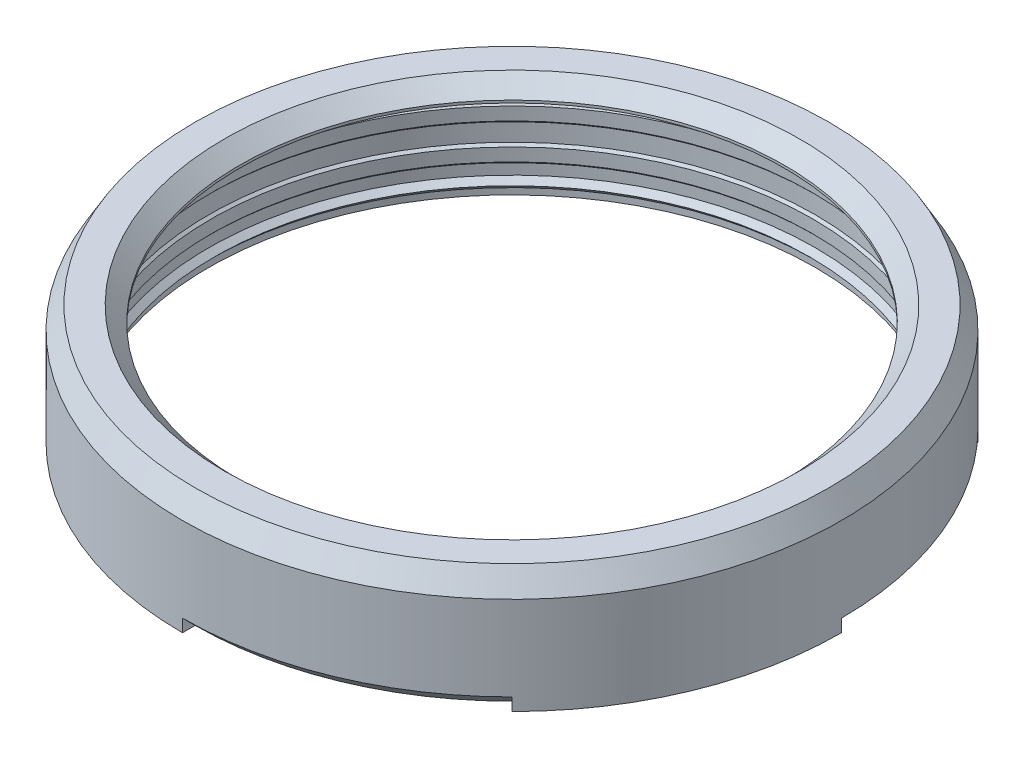
ISO-10303-21;
HEADER;
FILE_DESCRIPTION(('STEP AP214'),'2;1');
FILE_NAME('part.step','',(''),(''),'','','');
FILE_SCHEMA(('AUTOMOTIVE_DESIGN { 1 0 10303 214 1 1 1 1 }'));
ENDSEC;
DATA;
#1=APPLICATION_CONTEXT('core data for automotive mechanical design processes');
#2=APPLICATION_PROTOCOL_DEFINITION('international standard','automotive_design',2000,#1);
#3=PRODUCT_CONTEXT('',#1,'mechanical');
#4=PRODUCT('Part','Part','',(#3));
#5=PRODUCT_RELATED_PRODUCT_CATEGORY('part','',(#4));
#6=PRODUCT_DEFINITION_FORMATION('','',#4);
#7=PRODUCT_DEFINITION_CONTEXT('part definition',#1,'design');
#8=PRODUCT_DEFINITION('design','',#6,#7);
#9=PRODUCT_DEFINITION_SHAPE('','',#8);
#10=(LENGTH_UNIT() NAMED_UNIT(*) SI_UNIT(.MILLI.,.METRE.));
#11=(NAMED_UNIT(*) PLANE_ANGLE_UNIT() SI_UNIT($,.RADIAN.));
#12=(NAMED_UNIT(*) SI_UNIT($,.STERADIAN.) SOLID_ANGLE_UNIT());
#13=UNCERTAINTY_MEASURE_WITH_UNIT(LENGTH_MEASURE(1.E-05),#10,'distance_accuracy_value','');
#14=(GEOMETRIC_REPRESENTATION_CONTEXT(3) GLOBAL_UNCERTAINTY_ASSIGNED_CONTEXT((#13)) GLOBAL_UNIT_ASSIGNED_CONTEXT((#10,
#11,#12)) REPRESENTATION_CONTEXT('',''));
#15=CARTESIAN_POINT('',(0.,0.,0.));
#16=DIRECTION('',(0.,0.,1.));
#17=DIRECTION('',(1.,0.,0.));
#18=AXIS2_PLACEMENT_3D('',#15,#16,#17);
#19=CARTESIAN_POINT('',(0.,-1.39999999999982,0.));
#20=DIRECTION('',(0.,-1.,0.));
#21=DIRECTION('',(0.,0.,-1.));
#22=AXIS2_PLACEMENT_3D('',#19,#20,#21);
#23=TOROIDAL_SURFACE('',#22,22.5300000000011,1.39999999999979);
#24=CARTESIAN_POINT('',(0.,-1.39999999999982,0.));
#25=DIRECTION('',(0.,-1.,0.));
#26=DIRECTION('',(0.,0.,-1.));
#27=AXIS2_PLACEMENT_3D('',#24,#25,#26);
#28=CIRCLE('',#27,23.9300000000009);
#29=CARTESIAN_POINT('',(0.,-1.39999999999982,-23.9300000000009));
#30=VERTEX_POINT('',#29);
#31=EDGE_CURVE('E261',#30,#30,#28,.T.);
#32=ORIENTED_EDGE('',*,*,#31,.T.);
#33=EDGE_LOOP('',(#32));
#34=FACE_BOUND('',#33,.T.);
#35=CARTESIAN_POINT('',(0.,-0.0225022686042397,0.));
#36=DIRECTION('',(0.,-1.,0.));
#37=DIRECTION('',(0.,0.,-1.));
#38=AXIS2_PLACEMENT_3D('',#35,#36,#37);
#39=CIRCLE('',#38,22.78);
#40=CARTESIAN_POINT('',(0.,-0.0225022686042394,-22.78));
#41=VERTEX_POINT('',#40);
#42=EDGE_CURVE('E43',#41,#41,#39,.F.);
#43=ORIENTED_EDGE('',*,*,#42,.T.);
#44=EDGE_LOOP('',(#43));
#45=FACE_BOUND('',#44,.T.);
#46=ADVANCED_FACE('F38',(#34,#45),#23,.F.);
#47=CARTESIAN_POINT('',(0.,0.,0.));
#48=DIRECTION('',(0.,1.,0.));
#49=DIRECTION('',(0.,0.,1.));
#50=AXIS2_PLACEMENT_3D('',#47,#48,#49);
#51=PLANE('',#50);
#52=CARTESIAN_POINT('',(0.,0.,0.));
#53=DIRECTION('',(0.,1.,0.));
#54=DIRECTION('',(0.,0.,1.));
#55=AXIS2_PLACEMENT_3D('',#52,#53,#54);
#56=CIRCLE('',#55,21.5);
#57=CARTESIAN_POINT('',(0.,0.,21.5));
#58=VERTEX_POINT('',#57);
#59=EDGE_CURVE('E219',#58,#58,#56,.T.);
#60=ORIENTED_EDGE('',*,*,#59,.T.);
#61=EDGE_LOOP('',(#60));
#62=FACE_BOUND('',#61,.T.);
#63=CARTESIAN_POINT('',(0.,0.,0.));
#64=DIRECTION('',(0.,-1.,0.));
#65=DIRECTION('',(0.,0.,-1.));
#66=AXIS2_PLACEMENT_3D('',#63,#64,#65);
#67=CIRCLE('',#66,22.32);
#68=CARTESIAN_POINT('',(0.,0.,-22.32));
#69=VERTEX_POINT('',#68);
#70=EDGE_CURVE('E357',#69,#69,#67,.T.);
#71=ORIENTED_EDGE('',*,*,#70,.T.);
#72=EDGE_LOOP('',(#71));
#73=FACE_BOUND('',#72,.T.);
#74=ADVANCED_FACE('F292',(#62,#73),#51,.F.);
#75=CARTESIAN_POINT('',(0.,2.,0.));
#76=DIRECTION('',(0.,-1.,0.));
#77=DIRECTION('',(0.,0.,-1.));
#78=AXIS2_PLACEMENT_3D('',#75,#76,#77);
#79=CYLINDRICAL_SURFACE('',#78,26.);
#80=CARTESIAN_POINT('',(0.,-0.332000000000039,0.));
#81=DIRECTION('',(0.,1.,0.));
#82=DIRECTION('',(0.,0.,1.));
#83=AXIS2_PLACEMENT_3D('',#80,#81,#82);
#84=CIRCLE('',#83,26.);
#85=CARTESIAN_POINT('',(0.,-0.332000000000039,-26.));
#86=VERTEX_POINT('',#85);
#87=EDGE_CURVE('E269',#86,#86,#84,.F.);
#88=ORIENTED_EDGE('',*,*,#87,.T.);
#89=EDGE_LOOP('',(#88));
#90=FACE_BOUND('',#89,.T.);
#91=DIRECTION('',(0.,1.,0.));
#92=VECTOR('',#91,1.);
#93=CARTESIAN_POINT('',(-18.3847763108501,-7.99999999999999,-18.3847763108504));
#94=LINE('',#93,#92);
#95=CARTESIAN_POINT('',(-18.3847763108501,-7.99999999999999,-18.3847763108504));
#96=VERTEX_POINT('',#95);
#97=CARTESIAN_POINT('',(-18.3847763108501,-6.99999999999999,-18.3847763108504));
#98=VERTEX_POINT('',#97);
#99=EDGE_CURVE('E135',#96,#98,#94,.T.);
#100=ORIENTED_EDGE('',*,*,#99,.F.);
#101=CARTESIAN_POINT('',(0.,-7.99999999999999,0.));
#102=DIRECTION('',(0.,-1.,0.));
#103=DIRECTION('',(0.,0.,-1.));
#104=AXIS2_PLACEMENT_3D('',#101,#102,#103);
#105=CIRCLE('',#104,26.0000000000008);
#106=CARTESIAN_POINT('',(-26.0000000000008,-7.99999999999999,0.));
#107=VERTEX_POINT('',#106);
#108=EDGE_CURVE('E324',#107,#96,#105,.T.);
#109=ORIENTED_EDGE('',*,*,#108,.F.);
#110=DIRECTION('',(0.,1.,0.));
#111=VECTOR('',#110,1.);
#112=CARTESIAN_POINT('',(-26.,-7.99999999999999,0.));
#113=LINE('',#112,#111);
#114=CARTESIAN_POINT('',(-26.,-6.99999999999999,0.));
#115=VERTEX_POINT('',#114);
#116=EDGE_CURVE('E63',#107,#115,#113,.T.);
#117=ORIENTED_EDGE('',*,*,#116,.T.);
#118=CARTESIAN_POINT('',(0.,-6.99999999999999,0.));
#119=DIRECTION('',(0.,-1.,0.));
#120=DIRECTION('',(0.,0.,1.));
#121=AXIS2_PLACEMENT_3D('',#118,#119,#120);
#122=CIRCLE('',#121,26.);
#123=CARTESIAN_POINT('',(-18.3847763108502,-6.99999999999999,18.3847763108503));
#124=VERTEX_POINT('',#123);
#125=EDGE_CURVE('E143',#124,#115,#122,.T.);
#126=ORIENTED_EDGE('',*,*,#125,.F.);
#127=DIRECTION('',(0.,1.,0.));
#128=VECTOR('',#127,1.);
#129=CARTESIAN_POINT('',(-18.3847763108502,-7.99999999999999,18.3847763108503));
#130=LINE('',#129,#128);
#131=CARTESIAN_POINT('',(-18.3847763108502,-7.99999999999999,18.3847763108503));
#132=VERTEX_POINT('',#131);
#133=EDGE_CURVE('E149',#132,#124,#130,.T.);
#134=ORIENTED_EDGE('',*,*,#133,.F.);
#135=CARTESIAN_POINT('',(0.,-7.99999999999999,26.0000000000008));
#136=VERTEX_POINT('',#135);
#137=EDGE_CURVE('E224',#136,#132,#105,.T.);
#138=ORIENTED_EDGE('',*,*,#137,.F.);
#139=DIRECTION('',(0.,1.,0.));
#140=VECTOR('',#139,1.);
#141=CARTESIAN_POINT('',(0.,-7.99999999999999,26.));
#142=LINE('',#141,#140);
#143=CARTESIAN_POINT('',(0.,-6.99999999999999,26.));
#144=VERTEX_POINT('',#143);
#145=EDGE_CURVE('E181',#136,#144,#142,.T.);
#146=ORIENTED_EDGE('',*,*,#145,.T.);
#147=CARTESIAN_POINT('',(0.,-6.99999999999999,0.));
#148=DIRECTION('',(0.,-1.,0.));
#149=DIRECTION('',(1.,0.,0.));
#150=AXIS2_PLACEMENT_3D('',#147,#148,#149);
#151=CIRCLE('',#150,26.);
#152=CARTESIAN_POINT('',(18.3847763108502,-6.99999999999999,18.3847763108503));
#153=VERTEX_POINT('',#152);
#154=EDGE_CURVE('E186',#153,#144,#151,.T.);
#155=ORIENTED_EDGE('',*,*,#154,.F.);
#156=DIRECTION('',(0.,1.,0.));
#157=VECTOR('',#156,1.);
#158=CARTESIAN_POINT('',(18.3847763108502,-7.99999999999999,18.3847763108503));
#159=LINE('',#158,#157);
#160=CARTESIAN_POINT('',(18.3847763108502,-7.99999999999999,18.3847763108503));
#161=VERTEX_POINT('',#160);
#162=EDGE_CURVE('E194',#161,#153,#159,.T.);
#163=ORIENTED_EDGE('',*,*,#162,.F.);
#164=CARTESIAN_POINT('',(26.0000000000008,-7.99999999999999,0.));
#165=VERTEX_POINT('',#164);
#166=EDGE_CURVE('E220',#165,#161,#105,.T.);
#167=ORIENTED_EDGE('',*,*,#166,.F.);
#168=DIRECTION('',(0.,1.,0.));
#169=VECTOR('',#168,1.);
#170=CARTESIAN_POINT('',(26.,-7.99999999999999,0.));
#171=LINE('',#170,#169);
#172=CARTESIAN_POINT('',(26.,-6.99999999999999,0.));
#173=VERTEX_POINT('',#172);
#174=EDGE_CURVE('E200',#165,#173,#171,.T.);
#175=ORIENTED_EDGE('',*,*,#174,.T.);
#176=CARTESIAN_POINT('',(0.,-6.99999999999999,0.));
#177=DIRECTION('',(0.,-1.,0.));
#178=DIRECTION('',(0.,0.,-1.));
#179=AXIS2_PLACEMENT_3D('',#176,#177,#178);
#180=CIRCLE('',#179,26.);
#181=CARTESIAN_POINT('',(18.3847763108502,-6.99999999999999,-18.3847763108503));
#182=VERTEX_POINT('',#181);
#183=EDGE_CURVE('E217',#182,#173,#180,.T.);
#184=ORIENTED_EDGE('',*,*,#183,.F.);
#185=DIRECTION('',(0.,1.,0.));
#186=VECTOR('',#185,1.);
#187=CARTESIAN_POINT('',(18.3847763108502,-7.99999999999999,-18.3847763108503));
#188=LINE('',#187,#186);
#189=CARTESIAN_POINT('',(18.3847763108502,-7.99999999999999,-18.3847763108503));
#190=VERTEX_POINT('',#189);
#191=EDGE_CURVE('E209',#190,#182,#188,.T.);
#192=ORIENTED_EDGE('',*,*,#191,.F.);
#193=CARTESIAN_POINT('',(2.73194885518457E-13,-7.99999999999999,-26.0000000000008));
#194=VERTEX_POINT('',#193);
#195=EDGE_CURVE('E225',#194,#190,#105,.T.);
#196=ORIENTED_EDGE('',*,*,#195,.F.);
#197=DIRECTION('',(0.,1.,0.));
#198=VECTOR('',#197,1.);
#199=CARTESIAN_POINT('',(2.72335544429764E-13,-7.99999999999999,-26.));
#200=LINE('',#199,#198);
#201=CARTESIAN_POINT('',(2.72335544429764E-13,-6.99999999999999,-26.));
#202=VERTEX_POINT('',#201);
#203=EDGE_CURVE('E55',#194,#202,#200,.T.);
#204=ORIENTED_EDGE('',*,*,#203,.T.);
#205=CARTESIAN_POINT('',(0.,-6.99999999999999,0.));
#206=DIRECTION('',(0.,-1.,0.));
#207=DIRECTION('',(-1.,0.,0.));
#208=AXIS2_PLACEMENT_3D('',#205,#206,#207);
#209=CIRCLE('',#208,26.);
#210=EDGE_CURVE('E166',#98,#202,#209,.T.);
#211=ORIENTED_EDGE('',*,*,#210,.F.);
#212=EDGE_LOOP('',(#100,#109,#117,#126,#134,#138,#146,#155,#163,#167,#175,#184,#192,#196,#204,#211));
#213=FACE_BOUND('',#212,.T.);
#214=ADVANCED_FACE('F300',(#90,#213),#79,.T.);
#215=CARTESIAN_POINT('',(22.5166604983966,-7.99999999999999,12.9999999999996));
#216=DIRECTION('',(0.,-1.,0.));
#217=DIRECTION('',(0.,0.,-1.));
#218=AXIS2_PLACEMENT_3D('',#215,#216,#217);
#219=PLANE('',#218);
#220=CARTESIAN_POINT('',(0.,-7.99999999999999,0.));
#221=DIRECTION('',(0.,-1.,0.));
#222=DIRECTION('',(0.,0.,-1.));
#223=AXIS2_PLACEMENT_3D('',#220,#221,#222);
#224=CIRCLE('',#223,23.9300000000009);
#225=CARTESIAN_POINT('',(0.,-7.99999999999999,-23.9300000000009));
#226=VERTEX_POINT('',#225);
#227=EDGE_CURVE('E223',#226,#226,#224,.T.);
#228=ORIENTED_EDGE('',*,*,#227,.F.);
#229=EDGE_LOOP('',(#228));
#230=FACE_BOUND('',#229,.T.);
#231=ORIENTED_EDGE('',*,*,#108,.T.);
#232=DIRECTION('',(-0.707106781186541,0.,-0.707106781186554));
#233=VECTOR('',#232,1.);
#234=CARTESIAN_POINT('',(-17.6776695296635,-8.,-17.6776695296638));
#235=LINE('',#234,#233);
#236=CARTESIAN_POINT('',(-17.6776695296635,-8.,-17.6776695296638));
#237=VERTEX_POINT('',#236);
#238=EDGE_CURVE('E172',#237,#96,#235,.T.);
#239=ORIENTED_EDGE('',*,*,#238,.F.);
#240=CARTESIAN_POINT('',(0.,-8.,0.));
#241=DIRECTION('',(0.,-1.,0.));
#242=DIRECTION('',(-1.,0.,0.));
#243=AXIS2_PLACEMENT_3D('',#240,#241,#242);
#244=CIRCLE('',#243,25.);
#245=CARTESIAN_POINT('',(2.61861100413235E-13,-8.,-25.));
#246=VERTEX_POINT('',#245);
#247=EDGE_CURVE('E169',#237,#246,#244,.T.);
#248=ORIENTED_EDGE('',*,*,#247,.T.);
#249=DIRECTION('',(0.,0.,-1.));
#250=VECTOR('',#249,1.);
#251=CARTESIAN_POINT('',(2.61861100413235E-13,-8.,-25.));
#252=LINE('',#251,#250);
#253=EDGE_CURVE('E158',#246,#194,#252,.T.);
#254=ORIENTED_EDGE('',*,*,#253,.T.);
#255=ORIENTED_EDGE('',*,*,#195,.T.);
#256=DIRECTION('',(0.707106781186546,0.,-0.707106781186549));
#257=VECTOR('',#256,1.);
#258=CARTESIAN_POINT('',(17.6776695296637,-8.,-17.6776695296637));
#259=LINE('',#258,#257);
#260=CARTESIAN_POINT('',(17.6776695296637,-8.,-17.6776695296637));
#261=VERTEX_POINT('',#260);
#262=EDGE_CURVE('E206',#261,#190,#259,.T.);
#263=ORIENTED_EDGE('',*,*,#262,.F.);
#264=CARTESIAN_POINT('',(0.,-8.,0.));
#265=DIRECTION('',(0.,-1.,0.));
#266=DIRECTION('',(0.,0.,-1.));
#267=AXIS2_PLACEMENT_3D('',#264,#265,#266);
#268=CIRCLE('',#267,25.);
#269=CARTESIAN_POINT('',(25.,-8.,0.));
#270=VERTEX_POINT('',#269);
#271=EDGE_CURVE('E214',#261,#270,#268,.T.);
#272=ORIENTED_EDGE('',*,*,#271,.T.);
#273=DIRECTION('',(1.,0.,0.));
#274=VECTOR('',#273,1.);
#275=CARTESIAN_POINT('',(25.,-8.,0.));
#276=LINE('',#275,#274);
#277=EDGE_CURVE('E197',#270,#165,#276,.T.);
#278=ORIENTED_EDGE('',*,*,#277,.T.);
#279=ORIENTED_EDGE('',*,*,#166,.T.);
#280=DIRECTION('',(0.707106781186546,0.,0.707106781186549));
#281=VECTOR('',#280,1.);
#282=CARTESIAN_POINT('',(17.6776695296637,-8.,17.6776695296637));
#283=LINE('',#282,#281);
#284=CARTESIAN_POINT('',(17.6776695296637,-8.,17.6776695296637));
#285=VERTEX_POINT('',#284);
#286=EDGE_CURVE('E192',#285,#161,#283,.T.);
#287=ORIENTED_EDGE('',*,*,#286,.F.);
#288=CARTESIAN_POINT('',(0.,-8.,0.));
#289=DIRECTION('',(0.,-1.,0.));
#290=DIRECTION('',(1.,0.,0.));
#291=AXIS2_PLACEMENT_3D('',#288,#289,#290);
#292=CIRCLE('',#291,25.);
#293=CARTESIAN_POINT('',(0.,-8.,25.));
#294=VERTEX_POINT('',#293);
#295=EDGE_CURVE('E189',#285,#294,#292,.T.);
#296=ORIENTED_EDGE('',*,*,#295,.T.);
#297=DIRECTION('',(0.,0.,1.));
#298=VECTOR('',#297,1.);
#299=CARTESIAN_POINT('',(0.,-8.,25.));
#300=LINE('',#299,#298);
#301=EDGE_CURVE('E157',#294,#136,#300,.T.);
#302=ORIENTED_EDGE('',*,*,#301,.T.);
#303=ORIENTED_EDGE('',*,*,#137,.T.);
#304=DIRECTION('',(-0.707106781186546,0.,0.707106781186549));
#305=VECTOR('',#304,1.);
#306=CARTESIAN_POINT('',(-17.6776695296637,-8.,17.6776695296637));
#307=LINE('',#306,#305);
#308=CARTESIAN_POINT('',(-17.6776695296637,-8.,17.6776695296637));
#309=VERTEX_POINT('',#308);
#310=EDGE_CURVE('E147',#309,#132,#307,.T.);
#311=ORIENTED_EDGE('',*,*,#310,.F.);
#312=CARTESIAN_POINT('',(0.,-8.,0.));
#313=DIRECTION('',(0.,-1.,0.));
#314=DIRECTION('',(0.,0.,1.));
#315=AXIS2_PLACEMENT_3D('',#312,#313,#314);
#316=CIRCLE('',#315,25.);
#317=CARTESIAN_POINT('',(-25.,-8.,0.));
#318=VERTEX_POINT('',#317);
#319=EDGE_CURVE('E140',#309,#318,#316,.T.);
#320=ORIENTED_EDGE('',*,*,#319,.T.);
#321=DIRECTION('',(-1.,0.,0.));
#322=VECTOR('',#321,1.);
#323=CARTESIAN_POINT('',(-25.,-8.,0.));
#324=LINE('',#323,#322);
#325=EDGE_CURVE('E126',#318,#107,#324,.T.);
#326=ORIENTED_EDGE('',*,*,#325,.T.);
#327=EDGE_LOOP('',(#231,#239,#248,#254,#255,#263,#272,#278,#279,#287,#296,#302,#303,#311,#320,#326));
#328=FACE_BOUND('',#327,.T.);
#329=ADVANCED_FACE('F145',(#230,#328),#219,.T.);
#330=CARTESIAN_POINT('',(0.,-7.99999999999999,0.));
#331=DIRECTION('',(0.,1.,0.));
#332=DIRECTION('',(0.,0.,1.));
#333=AXIS2_PLACEMENT_3D('',#330,#331,#332);
#334=CYLINDRICAL_SURFACE('',#333,21.5);
#335=CARTESIAN_POINT('',(0.,0.200000000000035,0.));
#336=DIRECTION('',(0.,1.,0.));
#337=DIRECTION('',(0.,0.,1.));
#338=AXIS2_PLACEMENT_3D('',#335,#336,#337);
#339=CIRCLE('',#338,21.5);
#340=CARTESIAN_POINT('',(0.,0.200000000000033,21.5));
#341=VERTEX_POINT('',#340);
#342=EDGE_CURVE('E11',#341,#341,#339,.T.);
#343=CARTESIAN_POINT('',(0.,0.200000000000033,21.5));
#344=CARTESIAN_POINT('',(0.,0.1979166666667,21.5));
#345=CARTESIAN_POINT('',(0.,0.195833333333366,21.5));
#346=CARTESIAN_POINT('',(0.,0.191666666666699,21.5));
#347=CARTESIAN_POINT('',(0.,0.189583333333365,21.5));
#348=CARTESIAN_POINT('',(0.,0.185416666666698,21.5));
#349=CARTESIAN_POINT('',(0.,0.183333333333364,21.5));
#350=CARTESIAN_POINT('',(0.,0.179166666666697,21.5));
#351=CARTESIAN_POINT('',(0.,0.177083333333363,21.5));
#352=CARTESIAN_POINT('',(0.,0.172916666666696,21.5));
#353=CARTESIAN_POINT('',(0.,0.170833333333362,21.5));
#354=CARTESIAN_POINT('',(0.,0.166666666666695,21.5));
#355=CARTESIAN_POINT('',(0.,0.164583333333361,21.5));
#356=CARTESIAN_POINT('',(0.,0.160416666666694,21.5));
#357=CARTESIAN_POINT('',(0.,0.15833333333336,21.5));
#358=CARTESIAN_POINT('',(0.,0.154166666666692,21.5));
#359=CARTESIAN_POINT('',(0.,0.152083333333359,21.5));
#360=CARTESIAN_POINT('',(0.,0.147916666666691,21.5));
#361=CARTESIAN_POINT('',(0.,0.145833333333358,21.5));
#362=CARTESIAN_POINT('',(0.,0.14166666666669,21.5));
#363=CARTESIAN_POINT('',(0.,0.139583333333357,21.5));
#364=CARTESIAN_POINT('',(0.,0.135416666666689,21.5));
#365=CARTESIAN_POINT('',(0.,0.133333333333356,21.5));
#366=CARTESIAN_POINT('',(0.,0.129166666666688,21.5));
#367=CARTESIAN_POINT('',(0.,0.127083333333355,21.5));
#368=CARTESIAN_POINT('',(0.,0.122916666666687,21.5));
#369=CARTESIAN_POINT('',(0.,0.120833333333354,21.5));
#370=CARTESIAN_POINT('',(0.,0.116666666666686,21.5));
#371=CARTESIAN_POINT('',(0.,0.114583333333353,21.5));
#372=CARTESIAN_POINT('',(0.,0.110416666666685,21.5));
#373=CARTESIAN_POINT('',(0.,0.108333333333351,21.5));
#374=CARTESIAN_POINT('',(0.,0.104166666666684,21.5));
#375=CARTESIAN_POINT('',(0.,0.10208333333335,21.5));
#376=CARTESIAN_POINT('',(0.,0.0979166666666831,21.5));
#377=CARTESIAN_POINT('',(0.,0.0958333333333494,21.5));
#378=CARTESIAN_POINT('',(0.,0.091666666666682,21.5));
#379=CARTESIAN_POINT('',(0.,0.0895833333333483,21.5));
#380=CARTESIAN_POINT('',(0.,0.085416666666681,21.5));
#381=CARTESIAN_POINT('',(0.,0.0833333333333473,21.5));
#382=CARTESIAN_POINT('',(0.,0.0791666666666799,21.5));
#383=CARTESIAN_POINT('',(0.,0.0770833333333462,21.5));
#384=CARTESIAN_POINT('',(0.,0.0729166666666789,21.5));
#385=CARTESIAN_POINT('',(0.,0.0708333333333452,21.5));
#386=CARTESIAN_POINT('',(0.,0.0666666666666778,21.5));
#387=CARTESIAN_POINT('',(0.,0.0645833333333442,21.5));
#388=CARTESIAN_POINT('',(0.,0.0604166666666768,21.5));
#389=CARTESIAN_POINT('',(0.,0.0583333333333431,21.5));
#390=CARTESIAN_POINT('',(0.,0.0541666666666757,21.5));
#391=CARTESIAN_POINT('',(0.,0.0520833333333421,21.5));
#392=CARTESIAN_POINT('',(0.,0.0479166666666747,21.5));
#393=CARTESIAN_POINT('',(0.,0.045833333333341,21.5));
#394=CARTESIAN_POINT('',(0.,0.0416666666666736,21.5));
#395=CARTESIAN_POINT('',(0.,0.03958333333334,21.5));
#396=CARTESIAN_POINT('',(0.,0.0354166666666726,21.5));
#397=CARTESIAN_POINT('',(0.,0.0333333333333389,21.5));
#398=CARTESIAN_POINT('',(0.,0.0291666666666716,21.5));
#399=CARTESIAN_POINT('',(0.,0.0270833333333379,21.5));
#400=CARTESIAN_POINT('',(0.,0.0229166666666705,21.5));
#401=CARTESIAN_POINT('',(0.,0.0208333333333368,21.5));
#402=CARTESIAN_POINT('',(0.,0.0166666666666695,21.5));
#403=CARTESIAN_POINT('',(0.,0.0145833333333358,21.5));
#404=CARTESIAN_POINT('',(0.,0.0104166666666684,21.5));
#405=CARTESIAN_POINT('',(0.,0.00833333333333473,21.5));
#406=CARTESIAN_POINT('',(0.,0.00416666666666736,21.5));
#407=CARTESIAN_POINT('',(0.,0.00208333333333368,21.5));
#408=CARTESIAN_POINT('',(0.,0.,21.5));
#409=B_SPLINE_CURVE_WITH_KNOTS('',3,(#343,#344,#345,#346,#347,#348,#349,#350,#351,#352,#353,
#354,#355,#356,#357,#358,#359,#360,#361,#362,#363,#364,#365,#366,#367,#368,#369,#370,#371,#372,
#373,#374,#375,#376,#377,#378,#379,#380,#381,#382,#383,#384,#385,#386,#387,#388,#389,#390,#391,
#392,#393,#394,#395,#396,#397,#398,#399,#400,#401,#402,#403,#404,#405,#406,#407,#408),
.UNSPECIFIED.,.F.,.F.,(4,2,2,2,2,2,2,2,2,2,2,2,2,2,2,2,2,2,2,2,2,2,2,2,2,2,2,2,2,2,2,2,4),(0.,
0.00625000000000105,0.0125000000000021,0.0187500000000031,0.0250000000000042,0.0312500000000052,
0.0375000000000063,0.0437500000000073,0.0500000000000084,0.0562500000000094,0.0625000000000105,
0.0687500000000115,0.0750000000000126,0.0812500000000136,0.0875000000000146,0.0937500000000157,
0.100000000000017,0.106250000000018,0.112500000000019,0.11875000000002,0.125000000000021,
0.131250000000022,0.137500000000023,0.143750000000024,0.150000000000025,0.156250000000026,
0.162500000000027,0.168750000000028,0.175000000000029,0.18125000000003,0.187500000000031,
0.193750000000032,0.200000000000033),.UNSPECIFIED.);
#410=EDGE_CURVE('BSEAM317',#341,#58,#409,.T.);
#411=ORIENTED_EDGE('',*,*,#342,.T.);
#412=ORIENTED_EDGE('',*,*,#59,.F.);
#413=ORIENTED_EDGE('',*,*,#410,.T.);
#414=ORIENTED_EDGE('',*,*,#410,.F.);
#415=EDGE_LOOP('',(#411,#413,#412,#414));
#416=FACE_BOUND('',#415,.T.);
#417=ADVANCED_FACE('F317',(#416),#334,.F.);
#418=CARTESIAN_POINT('',(0.,0.,0.));
#419=DIRECTION('',(0.,-1.,0.));
#420=DIRECTION('',(0.,0.,-1.));
#421=AXIS2_PLACEMENT_3D('',#418,#419,#420);
#422=CYLINDRICAL_SURFACE('',#421,23.9300000000009);
#423=CARTESIAN_POINT('',(0.,-1.5999999999996,0.));
#424=DIRECTION('',(0.,-1.,0.));
#425=DIRECTION('',(0.,0.,-1.));
#426=AXIS2_PLACEMENT_3D('',#423,#424,#425);
#427=CIRCLE('',#426,23.9300000000009);
#428=CARTESIAN_POINT('',(0.,-1.5999999999996,-23.9300000000009));
#429=VERTEX_POINT('',#428);
#430=EDGE_CURVE('E258',#429,#429,#427,.T.);
#431=ORIENTED_EDGE('',*,*,#430,.T.);
#432=EDGE_LOOP('',(#431));
#433=FACE_BOUND('',#432,.T.);
#434=ORIENTED_EDGE('',*,*,#31,.F.);
#435=EDGE_LOOP('',(#434));
#436=FACE_BOUND('',#435,.T.);
#437=ADVANCED_FACE('F305',(#433,#436),#422,.F.);
#438=CARTESIAN_POINT('',(0.,-1.5999999999996,0.));
#439=DIRECTION('',(0.,1.,0.));
#440=DIRECTION('',(0.,0.,1.));
#441=AXIS2_PLACEMENT_3D('',#438,#439,#440);
#442=CONICAL_SURFACE('',#441,23.9300000000009,0.785398163397391);
#443=CARTESIAN_POINT('',(0.,-1.78999999999963,0.));
#444=DIRECTION('',(0.,-1.,0.));
#445=DIRECTION('',(0.,0.,-1.));
#446=AXIS2_PLACEMENT_3D('',#443,#444,#445);
#447=CIRCLE('',#446,23.7400000000009);
#448=CARTESIAN_POINT('',(0.,-1.78999999999963,-23.7400000000009));
#449=VERTEX_POINT('',#448);
#450=EDGE_CURVE('E255',#449,#449,#447,.T.);
#451=ORIENTED_EDGE('',*,*,#450,.T.);
#452=EDGE_LOOP('',(#451));
#453=FACE_BOUND('',#452,.T.);
#454=ORIENTED_EDGE('',*,*,#430,.F.);
#455=EDGE_LOOP('',(#454));
#456=FACE_BOUND('',#455,.T.);
#457=ADVANCED_FACE('F447',(#453,#456),#442,.F.);
#458=CARTESIAN_POINT('',(0.,0.,0.));
#459=DIRECTION('',(0.,-1.,0.));
#460=DIRECTION('',(0.,0.,-1.));
#461=AXIS2_PLACEMENT_3D('',#458,#459,#460);
#462=CYLINDRICAL_SURFACE('',#461,23.7400000000009);
#463=CARTESIAN_POINT('',(0.,-2.80999999999964,0.));
#464=DIRECTION('',(0.,-1.,0.));
#465=DIRECTION('',(0.,0.,-1.));
#466=AXIS2_PLACEMENT_3D('',#463,#464,#465);
#467=CIRCLE('',#466,23.7400000000009);
#468=CARTESIAN_POINT('',(0.,-2.80999999999964,-23.7400000000009));
#469=VERTEX_POINT('',#468);
#470=EDGE_CURVE('E252',#469,#469,#467,.T.);
#471=ORIENTED_EDGE('',*,*,#470,.T.);
#472=EDGE_LOOP('',(#471));
#473=FACE_BOUND('',#472,.T.);
#474=ORIENTED_EDGE('',*,*,#450,.F.);
#475=EDGE_LOOP('',(#474));
#476=FACE_BOUND('',#475,.T.);
#477=ADVANCED_FACE('F444',(#473,#476),#462,.F.);
#478=CARTESIAN_POINT('',(0.,-2.80999999999964,0.));
#479=DIRECTION('',(0.,-1.,0.));
#480=DIRECTION('',(0.,0.,-1.));
#481=AXIS2_PLACEMENT_3D('',#478,#479,#480);
#482=CONICAL_SURFACE('',#481,23.7400000000009,0.785398163397502);
#483=CARTESIAN_POINT('',(0.,-2.99999999999963,0.));
#484=DIRECTION('',(0.,-1.,0.));
#485=DIRECTION('',(0.,0.,-1.));
#486=AXIS2_PLACEMENT_3D('',#483,#484,#485);
#487=CIRCLE('',#486,23.9300000000009);
#488=CARTESIAN_POINT('',(0.,-2.99999999999963,-23.9300000000009));
#489=VERTEX_POINT('',#488);
#490=EDGE_CURVE('E249',#489,#489,#487,.T.);
#491=ORIENTED_EDGE('',*,*,#490,.T.);
#492=EDGE_LOOP('',(#491));
#493=FACE_BOUND('',#492,.T.);
#494=ORIENTED_EDGE('',*,*,#470,.F.);
#495=EDGE_LOOP('',(#494));
#496=FACE_BOUND('',#495,.T.);
#497=ADVANCED_FACE('F440',(#493,#496),#482,.F.);
#498=CARTESIAN_POINT('',(0.,0.,0.));
#499=DIRECTION('',(0.,-1.,0.));
#500=DIRECTION('',(0.,0.,-1.));
#501=AXIS2_PLACEMENT_3D('',#498,#499,#500);
#502=CYLINDRICAL_SURFACE('',#501,23.9300000000009);
#503=CARTESIAN_POINT('',(0.,-4.39999999999962,0.));
#504=DIRECTION('',(0.,-1.,0.));
#505=DIRECTION('',(0.,0.,-1.));
#506=AXIS2_PLACEMENT_3D('',#503,#504,#505);
#507=CIRCLE('',#506,23.9300000000009);
#508=CARTESIAN_POINT('',(0.,-4.39999999999962,-23.9300000000009));
#509=VERTEX_POINT('',#508);
#510=EDGE_CURVE('E246',#509,#509,#507,.T.);
#511=ORIENTED_EDGE('',*,*,#510,.T.);
#512=EDGE_LOOP('',(#511));
#513=FACE_BOUND('',#512,.T.);
#514=ORIENTED_EDGE('',*,*,#490,.F.);
#515=EDGE_LOOP('',(#514));
#516=FACE_BOUND('',#515,.T.);
#517=ADVANCED_FACE('F436',(#513,#516),#502,.F.);
#518=CARTESIAN_POINT('',(0.,-4.39999999999962,0.));
#519=DIRECTION('',(0.,1.,0.));
#520=DIRECTION('',(0.,0.,1.));
#521=AXIS2_PLACEMENT_3D('',#518,#519,#520);
#522=CONICAL_SURFACE('',#521,23.9300000000009,0.785398163397384);
#523=CARTESIAN_POINT('',(0.,-4.58999999999965,0.));
#524=DIRECTION('',(0.,-1.,0.));
#525=DIRECTION('',(0.,0.,-1.));
#526=AXIS2_PLACEMENT_3D('',#523,#524,#525);
#527=CIRCLE('',#526,23.7400000000009);
#528=CARTESIAN_POINT('',(0.,-4.58999999999965,-23.7400000000009));
#529=VERTEX_POINT('',#528);
#530=EDGE_CURVE('E243',#529,#529,#527,.T.);
#531=ORIENTED_EDGE('',*,*,#530,.T.);
#532=EDGE_LOOP('',(#531));
#533=FACE_BOUND('',#532,.T.);
#534=ORIENTED_EDGE('',*,*,#510,.F.);
#535=EDGE_LOOP('',(#534));
#536=FACE_BOUND('',#535,.T.);
#537=ADVANCED_FACE('F432',(#533,#536),#522,.F.);
#538=CARTESIAN_POINT('',(0.,0.,0.));
#539=DIRECTION('',(0.,-1.,0.));
#540=DIRECTION('',(0.,0.,-1.));
#541=AXIS2_PLACEMENT_3D('',#538,#539,#540);
#542=CYLINDRICAL_SURFACE('',#541,23.7400000000009);
#543=CARTESIAN_POINT('',(0.,-5.60999999999962,0.));
#544=DIRECTION('',(0.,-1.,0.));
#545=DIRECTION('',(0.,0.,-1.));
#546=AXIS2_PLACEMENT_3D('',#543,#544,#545);
#547=CIRCLE('',#546,23.7400000000009);
#548=CARTESIAN_POINT('',(0.,-5.60999999999962,-23.7400000000009));
#549=VERTEX_POINT('',#548);
#550=EDGE_CURVE('E240',#549,#549,#547,.T.);
#551=ORIENTED_EDGE('',*,*,#550,.T.);
#552=EDGE_LOOP('',(#551));
#553=FACE_BOUND('',#552,.T.);
#554=ORIENTED_EDGE('',*,*,#530,.F.);
#555=EDGE_LOOP('',(#554));
#556=FACE_BOUND('',#555,.T.);
#557=ADVANCED_FACE('F428',(#553,#556),#542,.F.);
#558=CARTESIAN_POINT('',(0.,-5.60999999999962,0.));
#559=DIRECTION('',(0.,-1.,0.));
#560=DIRECTION('',(0.,0.,-1.));
#561=AXIS2_PLACEMENT_3D('',#558,#559,#560);
#562=CONICAL_SURFACE('',#561,23.7400000000009,0.785398163397501);
#563=CARTESIAN_POINT('',(0.,-5.7999999999996,0.));
#564=DIRECTION('',(0.,-1.,0.));
#565=DIRECTION('',(0.,0.,-1.));
#566=AXIS2_PLACEMENT_3D('',#563,#564,#565);
#567=CIRCLE('',#566,23.9300000000009);
#568=CARTESIAN_POINT('',(0.,-5.7999999999996,-23.9300000000009));
#569=VERTEX_POINT('',#568);
#570=EDGE_CURVE('E237',#569,#569,#567,.T.);
#571=ORIENTED_EDGE('',*,*,#570,.T.);
#572=EDGE_LOOP('',(#571));
#573=FACE_BOUND('',#572,.T.);
#574=ORIENTED_EDGE('',*,*,#550,.F.);
#575=EDGE_LOOP('',(#574));
#576=FACE_BOUND('',#575,.T.);
#577=ADVANCED_FACE('F424',(#573,#576),#562,.F.);
#578=CARTESIAN_POINT('',(0.,0.,0.));
#579=DIRECTION('',(0.,-1.,0.));
#580=DIRECTION('',(0.,0.,-1.));
#581=AXIS2_PLACEMENT_3D('',#578,#579,#580);
#582=CYLINDRICAL_SURFACE('',#581,23.9300000000009);
#583=CARTESIAN_POINT('',(0.,-6.6499999999996,0.));
#584=DIRECTION('',(0.,-1.,0.));
#585=DIRECTION('',(0.,0.,-1.));
#586=AXIS2_PLACEMENT_3D('',#583,#584,#585);
#587=CIRCLE('',#586,23.9300000000009);
#588=CARTESIAN_POINT('',(0.,-6.6499999999996,-23.9300000000009));
#589=VERTEX_POINT('',#588);
#590=EDGE_CURVE('E234',#589,#589,#587,.T.);
#591=ORIENTED_EDGE('',*,*,#590,.T.);
#592=EDGE_LOOP('',(#591));
#593=FACE_BOUND('',#592,.T.);
#594=ORIENTED_EDGE('',*,*,#570,.F.);
#595=EDGE_LOOP('',(#594));
#596=FACE_BOUND('',#595,.T.);
#597=ADVANCED_FACE('F420',(#593,#596),#582,.F.);
#598=CARTESIAN_POINT('',(0.,-6.6499999999996,0.));
#599=DIRECTION('',(0.,1.,0.));
#600=DIRECTION('',(0.,0.,1.));
#601=AXIS2_PLACEMENT_3D('',#598,#599,#600);
#602=CONICAL_SURFACE('',#601,23.9300000000009,0.785398163397383);
#603=CARTESIAN_POINT('',(0.,-7.07499999999984,0.));
#604=DIRECTION('',(0.,-1.,0.));
#605=DIRECTION('',(0.,0.,-1.));
#606=AXIS2_PLACEMENT_3D('',#603,#604,#605);
#607=CIRCLE('',#606,23.5050000000007);
#608=CARTESIAN_POINT('',(0.,-7.07499999999984,-23.5050000000007));
#609=VERTEX_POINT('',#608);
#610=EDGE_CURVE('E231',#609,#609,#607,.T.);
#611=ORIENTED_EDGE('',*,*,#610,.T.);
#612=EDGE_LOOP('',(#611));
#613=FACE_BOUND('',#612,.T.);
#614=ORIENTED_EDGE('',*,*,#590,.F.);
#615=EDGE_LOOP('',(#614));
#616=FACE_BOUND('',#615,.T.);
#617=ADVANCED_FACE('F416',(#613,#616),#602,.F.);
#618=CARTESIAN_POINT('',(0.,-7.07499999999984,0.));
#619=DIRECTION('',(0.,-1.,0.));
#620=DIRECTION('',(0.,0.,-1.));
#621=AXIS2_PLACEMENT_3D('',#618,#619,#620);
#622=CONICAL_SURFACE('',#621,23.5050000000007,0.785398163397507);
#623=CARTESIAN_POINT('',(0.,-7.49999999999998,0.));
#624=DIRECTION('',(0.,-1.,0.));
#625=DIRECTION('',(0.,0.,-1.));
#626=AXIS2_PLACEMENT_3D('',#623,#624,#625);
#627=CIRCLE('',#626,23.9300000000009);
#628=CARTESIAN_POINT('',(0.,-7.49999999999998,-23.9300000000009));
#629=VERTEX_POINT('',#628);
#630=EDGE_CURVE('E228',#629,#629,#627,.T.);
#631=ORIENTED_EDGE('',*,*,#630,.T.);
#632=EDGE_LOOP('',(#631));
#633=FACE_BOUND('',#632,.T.);
#634=ORIENTED_EDGE('',*,*,#610,.F.);
#635=EDGE_LOOP('',(#634));
#636=FACE_BOUND('',#635,.T.);
#637=ADVANCED_FACE('F412',(#633,#636),#622,.F.);
#638=CARTESIAN_POINT('',(0.,0.,0.));
#639=DIRECTION('',(0.,-1.,0.));
#640=DIRECTION('',(0.,0.,-1.));
#641=AXIS2_PLACEMENT_3D('',#638,#639,#640);
#642=CYLINDRICAL_SURFACE('',#641,23.9300000000009);
#643=ORIENTED_EDGE('',*,*,#227,.T.);
#644=EDGE_LOOP('',(#643));
#645=FACE_BOUND('',#644,.T.);
#646=ORIENTED_EDGE('',*,*,#630,.F.);
#647=EDGE_LOOP('',(#646));
#648=FACE_BOUND('',#647,.T.);
#649=ADVANCED_FACE('F406',(#645,#648),#642,.F.);
#650=CARTESIAN_POINT('',(0.,1.4,0.));
#651=DIRECTION('',(0.,1.,0.));
#652=DIRECTION('',(0.,0.,1.));
#653=AXIS2_PLACEMENT_3D('',#650,#651,#652);
#654=PLANE('',#653);
#655=CARTESIAN_POINT('',(0.,1.4,0.));
#656=DIRECTION('',(0.,1.,0.));
#657=DIRECTION('',(0.,0.,1.));
#658=AXIS2_PLACEMENT_3D('',#655,#656,#657);
#659=CIRCLE('',#658,22.7);
#660=CARTESIAN_POINT('',(0.,1.4,22.7));
#661=VERTEX_POINT('',#660);
#662=EDGE_CURVE('E48',#661,#661,#659,.F.);
#663=ORIENTED_EDGE('',*,*,#662,.T.);
#664=EDGE_LOOP('',(#663));
#665=FACE_BOUND('',#664,.T.);
#666=CARTESIAN_POINT('',(0.,1.4,0.));
#667=DIRECTION('',(0.,1.,0.));
#668=DIRECTION('',(0.,0.,1.));
#669=AXIS2_PLACEMENT_3D('',#666,#667,#668);
#670=CIRCLE('',#669,25.0000293337635);
#671=CARTESIAN_POINT('',(0.,1.4,-25.0000293337635));
#672=VERTEX_POINT('',#671);
#673=EDGE_CURVE('E264',#672,#672,#670,.T.);
#674=ORIENTED_EDGE('',*,*,#673,.T.);
#675=EDGE_LOOP('',(#674));
#676=FACE_BOUND('',#675,.T.);
#677=ADVANCED_FACE('F275',(#665,#676),#654,.T.);
#678=CARTESIAN_POINT('',(0.,1.4,0.));
#679=DIRECTION('',(0.,-1.,0.));
#680=DIRECTION('',(0.,0.,-1.));
#681=AXIS2_PLACEMENT_3D('',#678,#679,#680);
#682=CONICAL_SURFACE('',#681,25.0000293337635,0.523598775598297);
#683=CARTESIAN_POINT('',(0.,-0.332000000000039,-26.));
#684=CARTESIAN_POINT('',(0.,-0.313958333333372,-25.9895836388934));
#685=CARTESIAN_POINT('',(0.,-0.295916666666705,-25.9791672777867));
#686=CARTESIAN_POINT('',(0.,-0.259833333333371,-25.9583345555735));
#687=CARTESIAN_POINT('',(0.,-0.241791666666704,-25.9479181944669));
#688=CARTESIAN_POINT('',(0.,-0.20570833333337,-25.9270854722536));
#689=CARTESIAN_POINT('',(0.,-0.187666666666702,-25.916669111147));
#690=CARTESIAN_POINT('',(0.,-0.151583333333368,-25.8958363889337));
#691=CARTESIAN_POINT('',(0.,-0.133541666666701,-25.8854200278271));
#692=CARTESIAN_POINT('',(0.,-0.0974583333333672,-25.8645873056138));
#693=CARTESIAN_POINT('',(0.,-0.0794166666667001,-25.8541709445072));
#694=CARTESIAN_POINT('',(0.,-0.0433333333333659,-25.8333382222939));
#695=CARTESIAN_POINT('',(0.,-0.0252916666666987,-25.8229218611873));
#696=CARTESIAN_POINT('',(0.,0.0107916666666352,-25.802089138974));
#697=CARTESIAN_POINT('',(0.,0.0288333333333021,-25.7916727778674));
#698=CARTESIAN_POINT('',(0.,0.0649166666666364,-25.7708400556541));
#699=CARTESIAN_POINT('',(0.,0.0829583333333038,-25.7604236945475));
#700=CARTESIAN_POINT('',(0.,0.119041666666638,-25.7395909723343));
#701=CARTESIAN_POINT('',(0.,0.137083333333305,-25.7291746112276));
#702=CARTESIAN_POINT('',(0.,0.173166666666639,-25.7083418890144));
#703=CARTESIAN_POINT('',(0.,0.191208333333306,-25.6979255279077));
#704=CARTESIAN_POINT('',(0.,0.22729166666664,-25.6770928056945));
#705=CARTESIAN_POINT('',(0.,0.245333333333307,-25.6666764445879));
#706=CARTESIAN_POINT('',(0.,0.281416666666642,-25.6458437223746));
#707=CARTESIAN_POINT('',(0.,0.299458333333309,-25.635427361268));
#708=CARTESIAN_POINT('',(0.,0.335541666666643,-25.6145946390547));
#709=CARTESIAN_POINT('',(0.,0.35358333333331,-25.6041782779481));
#710=CARTESIAN_POINT('',(0.,0.389666666666644,-25.5833455557348));
#711=CARTESIAN_POINT('',(0.,0.407708333333311,-25.5729291946282));
#712=CARTESIAN_POINT('',(0.,0.443791666666646,-25.5520964724149));
#713=CARTESIAN_POINT('',(0.,0.461833333333312,-25.5416801113083));
#714=CARTESIAN_POINT('',(0.,0.497916666666646,-25.520847389095));
#715=CARTESIAN_POINT('',(0.,0.515958333333314,-25.5104310279884));
#716=CARTESIAN_POINT('',(0.,0.552041666666648,-25.4895983057751));
#717=CARTESIAN_POINT('',(0.,0.570083333333315,-25.4791819446685));
#718=CARTESIAN_POINT('',(0.,0.606166666666649,-25.4583492224553));
#719=CARTESIAN_POINT('',(0.,0.624208333333316,-25.4479328613486));
#720=CARTESIAN_POINT('',(0.,0.66029166666665,-25.4271001391354));
#721=CARTESIAN_POINT('',(0.,0.678333333333317,-25.4166837780287));
#722=CARTESIAN_POINT('',(0.,0.714416666666652,-25.3958510558155));
#723=CARTESIAN_POINT('',(0.,0.732458333333318,-25.3854346947089));
#724=CARTESIAN_POINT('',(0.,0.768541666666652,-25.3646019724956));
#725=CARTESIAN_POINT('',(0.,0.78658333333332,-25.354185611389));
#726=CARTESIAN_POINT('',(0.,0.822666666666654,-25.3333528891757));
#727=CARTESIAN_POINT('',(0.,0.840708333333321,-25.3229365280691));
#728=CARTESIAN_POINT('',(0.,0.876791666666655,-25.3021038058558));
#729=CARTESIAN_POINT('',(0.,0.894833333333322,-25.2916874447492));
#730=CARTESIAN_POINT('',(0.,0.930916666666656,-25.2708547225359));
#731=CARTESIAN_POINT('',(0.,0.948958333333323,-25.2604383614293));
#732=CARTESIAN_POINT('',(0.,0.985041666666657,-25.239605639216));
#733=CARTESIAN_POINT('',(0.,1.00308333333332,-25.2291892781094));
#734=CARTESIAN_POINT('',(0.,1.03916666666666,-25.2083565558961));
#735=CARTESIAN_POINT('',(0.,1.05720833333333,-25.1979401947895));
#736=CARTESIAN_POINT('',(0.,1.09329166666666,-25.1771074725763));
#737=CARTESIAN_POINT('',(0.,1.11133333333333,-25.1666911114696));
#738=CARTESIAN_POINT('',(0.,1.14741666666666,-25.1458583892564));
#739=CARTESIAN_POINT('',(0.,1.16545833333333,-25.1354420281497));
#740=CARTESIAN_POINT('',(0.,1.20154166666666,-25.1146093059365));
#741=CARTESIAN_POINT('',(0.,1.21958333333333,-25.1041929448298));
#742=CARTESIAN_POINT('',(0.,1.25566666666666,-25.0833602226166));
#743=CARTESIAN_POINT('',(0.,1.27370833333333,-25.07294386151));
#744=CARTESIAN_POINT('',(0.,1.30979166666667,-25.0521111392967));
#745=CARTESIAN_POINT('',(0.,1.32783333333333,-25.0416947781901));
#746=CARTESIAN_POINT('',(0.,1.36391666666667,-25.0208620559768));
#747=CARTESIAN_POINT('',(0.,1.38195833333333,-25.0104456948702));
#748=CARTESIAN_POINT('',(0.,1.4,-25.0000293337635));
#749=B_SPLINE_CURVE_WITH_KNOTS('',3,(#683,#684,#685,#686,#687,#688,#689,#690,#691,#692,#693,
#694,#695,#696,#697,#698,#699,#700,#701,#702,#703,#704,#705,#706,#707,#708,#709,#710,#711,#712,
#713,#714,#715,#716,#717,#718,#719,#720,#721,#722,#723,#724,#725,#726,#727,#728,#729,#730,#731,
#732,#733,#734,#735,#736,#737,#738,#739,#740,#741,#742,#743,#744,#745,#746,#747,#748),
.UNSPECIFIED.,.F.,.F.,(4,2,2,2,2,2,2,2,2,2,2,2,2,2,2,2,2,2,2,2,2,2,2,2,2,2,2,2,2,2,2,2,4),(0.,
0.0624981666397787,0.124996333279557,0.187494499919334,0.249992666559113,0.312490833198892,
0.37498899983867,0.437487166478449,0.499985333118226,0.562483499758004,0.624981666397783,
0.687479833037562,0.74997799967734,0.812476166317119,0.874974332956896,0.937472499596675,
0.999970666236453,1.06246883287623,1.12496699951601,1.18746516615579,1.24996333279557,
1.31246149943534,1.37495966607512,1.4374578327149,1.49995599935468,1.56245416599446,
1.62495233263424,1.68745049927401,1.74994866591379,1.81244683255357,1.87494499919335,
1.93744316583313,1.99994133247291),.UNSPECIFIED.);
#750=EDGE_CURVE('BSEAM280',#86,#672,#749,.T.);
#751=ORIENTED_EDGE('',*,*,#87,.F.);
#752=ORIENTED_EDGE('',*,*,#673,.F.);
#753=ORIENTED_EDGE('',*,*,#750,.T.);
#754=ORIENTED_EDGE('',*,*,#750,.F.);
#755=EDGE_LOOP('',(#751,#753,#752,#754));
#756=FACE_BOUND('',#755,.T.);
#757=ADVANCED_FACE('F280',(#756),#682,.T.);
#758=CARTESIAN_POINT('',(0.,1.4,0.));
#759=DIRECTION('',(0.,1.,0.));
#760=DIRECTION('',(0.,0.,1.));
#761=AXIS2_PLACEMENT_3D('',#758,#759,#760);
#762=CONICAL_SURFACE('',#761,22.7,0.785398163397448);
#763=ORIENTED_EDGE('',*,*,#342,.F.);
#764=EDGE_LOOP('',(#763));
#765=FACE_BOUND('',#764,.T.);
#766=ORIENTED_EDGE('',*,*,#662,.F.);
#767=EDGE_LOOP('',(#766));
#768=FACE_BOUND('',#767,.T.);
#769=ADVANCED_FACE('F41',(#765,#768),#762,.F.);
#770=CARTESIAN_POINT('',(0.,-6.99999999999999,0.));
#771=DIRECTION('',(0.,1.,0.));
#772=DIRECTION('',(0.,0.,1.));
#773=AXIS2_PLACEMENT_3D('',#770,#771,#772);
#774=CONICAL_SURFACE('',#773,26.,0.785398163397442);
#775=DIRECTION('',(-0.499999999999996,-0.707106781186552,0.499999999999998));
#776=VECTOR('',#775,1.);
#777=CARTESIAN_POINT('',(18.3847763108502,-6.99999999999999,-18.3847763108503));
#778=LINE('',#777,#776);
#779=EDGE_CURVE('E211',#182,#261,#778,.T.);
#780=ORIENTED_EDGE('',*,*,#779,.F.);
#781=ORIENTED_EDGE('',*,*,#183,.T.);
#782=DIRECTION('',(-0.707106781186543,-0.707106781186552,0.));
#783=VECTOR('',#782,1.);
#784=CARTESIAN_POINT('',(26.,-6.99999999999999,0.));
#785=LINE('',#784,#783);
#786=EDGE_CURVE('E203',#173,#270,#785,.T.);
#787=ORIENTED_EDGE('',*,*,#786,.T.);
#788=ORIENTED_EDGE('',*,*,#271,.F.);
#789=EDGE_LOOP('',(#780,#781,#787,#788));
#790=FACE_BOUND('',#789,.T.);
#791=ADVANCED_FACE('F279',(#790),#774,.T.);
#792=CARTESIAN_POINT('',(0.,0.,0.));
#793=DIRECTION('',(0.707106781186549,0.,0.707106781186546));
#794=DIRECTION('',(0.707106781186546,0.,-0.707106781186549));
#795=AXIS2_PLACEMENT_3D('',#792,#793,#794);
#796=PLANE('',#795);
#797=ORIENTED_EDGE('',*,*,#262,.T.);
#798=ORIENTED_EDGE('',*,*,#191,.T.);
#799=ORIENTED_EDGE('',*,*,#779,.T.);
#800=EDGE_LOOP('',(#797,#798,#799));
#801=FACE_BOUND('',#800,.T.);
#802=ADVANCED_FACE('F286',(#801),#796,.T.);
#803=CARTESIAN_POINT('',(0.,0.,0.));
#804=DIRECTION('',(0.,0.,1.));
#805=DIRECTION('',(1.,0.,0.));
#806=AXIS2_PLACEMENT_3D('',#803,#804,#805);
#807=PLANE('',#806);
#808=ORIENTED_EDGE('',*,*,#277,.F.);
#809=ORIENTED_EDGE('',*,*,#786,.F.);
#810=ORIENTED_EDGE('',*,*,#174,.F.);
#811=EDGE_LOOP('',(#808,#809,#810));
#812=FACE_BOUND('',#811,.T.);
#813=ADVANCED_FACE('F336',(#812),#807,.F.);
#814=CARTESIAN_POINT('',(0.,0.,0.));
#815=DIRECTION('',(-0.707106781186549,0.,0.707106781186546));
#816=DIRECTION('',(0.707106781186546,0.,0.707106781186549));
#817=AXIS2_PLACEMENT_3D('',#814,#815,#816);
#818=PLANE('',#817);
#819=ORIENTED_EDGE('',*,*,#286,.T.);
#820=ORIENTED_EDGE('',*,*,#162,.T.);
#821=DIRECTION('',(-0.499999999999996,-0.707106781186552,-0.499999999999998));
#822=VECTOR('',#821,1.);
#823=CARTESIAN_POINT('',(18.3847763108502,-6.99999999999999,18.3847763108503));
#824=LINE('',#823,#822);
#825=EDGE_CURVE('E184',#153,#285,#824,.T.);
#826=ORIENTED_EDGE('',*,*,#825,.T.);
#827=EDGE_LOOP('',(#819,#820,#826));
#828=FACE_BOUND('',#827,.T.);
#829=ADVANCED_FACE('F341',(#828),#818,.T.);
#830=CARTESIAN_POINT('',(0.,-6.99999999999999,0.));
#831=DIRECTION('',(0.,1.,0.));
#832=DIRECTION('',(-1.,0.,0.));
#833=AXIS2_PLACEMENT_3D('',#830,#831,#832);
#834=CONICAL_SURFACE('',#833,26.,0.785398163397442);
#835=ORIENTED_EDGE('',*,*,#825,.F.);
#836=ORIENTED_EDGE('',*,*,#154,.T.);
#837=DIRECTION('',(0.,-0.707106781186552,-0.707106781186543));
#838=VECTOR('',#837,1.);
#839=CARTESIAN_POINT('',(0.,-6.99999999999999,26.));
#840=LINE('',#839,#838);
#841=EDGE_CURVE('E178',#144,#294,#840,.T.);
#842=ORIENTED_EDGE('',*,*,#841,.T.);
#843=ORIENTED_EDGE('',*,*,#295,.F.);
#844=EDGE_LOOP('',(#835,#836,#842,#843));
#845=FACE_BOUND('',#844,.T.);
#846=ADVANCED_FACE('F345',(#845),#834,.T.);
#847=CARTESIAN_POINT('',(0.,0.,0.));
#848=DIRECTION('',(-1.,0.,0.));
#849=DIRECTION('',(0.,0.,1.));
#850=AXIS2_PLACEMENT_3D('',#847,#848,#849);
#851=PLANE('',#850);
#852=ORIENTED_EDGE('',*,*,#301,.F.);
#853=ORIENTED_EDGE('',*,*,#841,.F.);
#854=ORIENTED_EDGE('',*,*,#145,.F.);
#855=EDGE_LOOP('',(#852,#853,#854));
#856=FACE_BOUND('',#855,.T.);
#857=ADVANCED_FACE('F347',(#856),#851,.F.);
#858=CARTESIAN_POINT('',(0.,0.,0.));
#859=DIRECTION('',(-0.707106781186549,0.,-0.707106781186546));
#860=DIRECTION('',(-0.707106781186546,0.,0.707106781186549));
#861=AXIS2_PLACEMENT_3D('',#858,#859,#860);
#862=PLANE('',#861);
#863=ORIENTED_EDGE('',*,*,#310,.T.);
#864=ORIENTED_EDGE('',*,*,#133,.T.);
#865=DIRECTION('',(0.499999999999996,-0.707106781186552,-0.499999999999998));
#866=VECTOR('',#865,1.);
#867=CARTESIAN_POINT('',(-18.3847763108502,-6.99999999999999,18.3847763108503));
#868=LINE('',#867,#866);
#869=EDGE_CURVE('E151',#124,#309,#868,.T.);
#870=ORIENTED_EDGE('',*,*,#869,.T.);
#871=EDGE_LOOP('',(#863,#864,#870));
#872=FACE_BOUND('',#871,.T.);
#873=ADVANCED_FACE('F350',(#872),#862,.T.);
#874=CARTESIAN_POINT('',(0.,-6.99999999999999,0.));
#875=DIRECTION('',(0.,1.,0.));
#876=DIRECTION('',(0.,0.,-1.));
#877=AXIS2_PLACEMENT_3D('',#874,#875,#876);
#878=CONICAL_SURFACE('',#877,26.,0.785398163397442);
#879=ORIENTED_EDGE('',*,*,#869,.F.);
#880=ORIENTED_EDGE('',*,*,#125,.T.);
#881=DIRECTION('',(0.707106781186543,-0.707106781186552,0.));
#882=VECTOR('',#881,1.);
#883=CARTESIAN_POINT('',(-26.,-6.99999999999999,0.));
#884=LINE('',#883,#882);
#885=EDGE_CURVE('E129',#115,#318,#884,.T.);
#886=ORIENTED_EDGE('',*,*,#885,.T.);
#887=ORIENTED_EDGE('',*,*,#319,.F.);
#888=EDGE_LOOP('',(#879,#880,#886,#887));
#889=FACE_BOUND('',#888,.T.);
#890=ADVANCED_FACE('F139',(#889),#878,.T.);
#891=CARTESIAN_POINT('',(0.,0.,0.));
#892=DIRECTION('',(0.,0.,-1.));
#893=DIRECTION('',(-1.,0.,0.));
#894=AXIS2_PLACEMENT_3D('',#891,#892,#893);
#895=PLANE('',#894);
#896=ORIENTED_EDGE('',*,*,#325,.F.);
#897=ORIENTED_EDGE('',*,*,#885,.F.);
#898=ORIENTED_EDGE('',*,*,#116,.F.);
#899=EDGE_LOOP('',(#896,#897,#898));
#900=FACE_BOUND('',#899,.T.);
#901=ADVANCED_FACE('F128',(#900),#895,.F.);
#902=CARTESIAN_POINT('',(0.,0.,0.));
#903=DIRECTION('',(0.707106781186554,0.,-0.707106781186541));
#904=DIRECTION('',(-0.707106781186541,0.,-0.707106781186554));
#905=AXIS2_PLACEMENT_3D('',#902,#903,#904);
#906=PLANE('',#905);
#907=ORIENTED_EDGE('',*,*,#238,.T.);
#908=ORIENTED_EDGE('',*,*,#99,.T.);
#909=DIRECTION('',(0.499999999999992,-0.707106781186552,0.500000000000001));
#910=VECTOR('',#909,1.);
#911=CARTESIAN_POINT('',(-18.3847763108501,-6.99999999999999,-18.3847763108504));
#912=LINE('',#911,#910);
#913=EDGE_CURVE('E164',#98,#237,#912,.T.);
#914=ORIENTED_EDGE('',*,*,#913,.T.);
#915=EDGE_LOOP('',(#907,#908,#914));
#916=FACE_BOUND('',#915,.T.);
#917=ADVANCED_FACE('F384',(#916),#906,.T.);
#918=CARTESIAN_POINT('',(0.,-6.99999999999999,0.));
#919=DIRECTION('',(0.,1.,0.));
#920=DIRECTION('',(1.,0.,0.));
#921=AXIS2_PLACEMENT_3D('',#918,#919,#920);
#922=CONICAL_SURFACE('',#921,26.,0.785398163397442);
#923=ORIENTED_EDGE('',*,*,#913,.F.);
#924=ORIENTED_EDGE('',*,*,#210,.T.);
#925=DIRECTION('',(0.,-0.707106781186552,0.707106781186543));
#926=VECTOR('',#925,1.);
#927=CARTESIAN_POINT('',(2.72335544429764E-13,-6.99999999999999,-26.));
#928=LINE('',#927,#926);
#929=EDGE_CURVE('E160',#202,#246,#928,.T.);
#930=ORIENTED_EDGE('',*,*,#929,.T.);
#931=ORIENTED_EDGE('',*,*,#247,.F.);
#932=EDGE_LOOP('',(#923,#924,#930,#931));
#933=FACE_BOUND('',#932,.T.);
#934=ADVANCED_FACE('F378',(#933),#922,.T.);
#935=CARTESIAN_POINT('',(0.,0.,0.));
#936=DIRECTION('',(1.,0.,0.));
#937=DIRECTION('',(0.,0.,-1.));
#938=AXIS2_PLACEMENT_3D('',#935,#936,#937);
#939=PLANE('',#938);
#940=ORIENTED_EDGE('',*,*,#253,.F.);
#941=ORIENTED_EDGE('',*,*,#929,.F.);
#942=ORIENTED_EDGE('',*,*,#203,.F.);
#943=EDGE_LOOP('',(#940,#941,#942));
#944=FACE_BOUND('',#943,.T.);
#945=ADVANCED_FACE('F369',(#944),#939,.F.);
#946=CARTESIAN_POINT('',(0.,-0.5,0.));
#947=DIRECTION('',(0.,-1.,0.));
#948=DIRECTION('',(0.,0.,-1.));
#949=AXIS2_PLACEMENT_3D('',#946,#947,#948);
#950=PLANE('',#949);
#951=CARTESIAN_POINT('',(0.,-0.5,0.));
#952=DIRECTION('',(0.,-1.,0.));
#953=DIRECTION('',(0.,0.,-1.));
#954=AXIS2_PLACEMENT_3D('',#951,#952,#953);
#955=CIRCLE('',#954,22.78);
#956=CARTESIAN_POINT('',(0.,-0.5,-22.78));
#957=VERTEX_POINT('',#956);
#958=EDGE_CURVE('E353',#957,#957,#955,.T.);
#959=ORIENTED_EDGE('',*,*,#958,.T.);
#960=EDGE_LOOP('',(#959));
#961=FACE_BOUND('',#960,.T.);
#962=CARTESIAN_POINT('',(0.,-0.5,0.));
#963=DIRECTION('',(0.,-1.,0.));
#964=DIRECTION('',(0.,0.,-1.));
#965=AXIS2_PLACEMENT_3D('',#962,#963,#964);
#966=CIRCLE('',#965,22.32);
#967=CARTESIAN_POINT('',(0.,-0.5,-22.32));
#968=VERTEX_POINT('',#967);
#969=EDGE_CURVE('E356',#968,#968,#966,.T.);
#970=ORIENTED_EDGE('',*,*,#969,.F.);
#971=EDGE_LOOP('',(#970));
#972=FACE_BOUND('',#971,.T.);
#973=ADVANCED_FACE('F366',(#961,#972),#950,.T.);
#974=CARTESIAN_POINT('',(0.,-0.5,0.));
#975=DIRECTION('',(0.,1.,0.));
#976=DIRECTION('',(0.,0.,1.));
#977=AXIS2_PLACEMENT_3D('',#974,#975,#976);
#978=CYLINDRICAL_SURFACE('',#977,22.78);
#979=ORIENTED_EDGE('',*,*,#42,.F.);
#980=EDGE_LOOP('',(#979));
#981=FACE_BOUND('',#980,.T.);
#982=ORIENTED_EDGE('',*,*,#958,.F.);
#983=EDGE_LOOP('',(#982));
#984=FACE_BOUND('',#983,.T.);
#985=ADVANCED_FACE('F368',(#981,#984),#978,.T.);
#986=CARTESIAN_POINT('',(0.,-0.5,0.));
#987=DIRECTION('',(0.,1.,0.));
#988=DIRECTION('',(0.,0.,1.));
#989=AXIS2_PLACEMENT_3D('',#986,#987,#988);
#990=CYLINDRICAL_SURFACE('',#989,22.32);
#991=ORIENTED_EDGE('',*,*,#969,.T.);
#992=EDGE_LOOP('',(#991));
#993=FACE_BOUND('',#992,.T.);
#994=ORIENTED_EDGE('',*,*,#70,.F.);
#995=EDGE_LOOP('',(#994));
#996=FACE_BOUND('',#995,.T.);
#997=ADVANCED_FACE('F363',(#993,#996),#990,.F.);
#998=CLOSED_SHELL('',(#46,#74,#214,#329,#417,#437,#457,#477,#497,#517,#537,#557,#577,#597,#617,
#637,#649,#677,#757,#769,#791,#802,#813,#829,#846,#857,#873,#890,#901,#917,#934,#945,#973,#985,#997));
#999=MANIFOLD_SOLID_BREP('B2',#998);
#1000=ADVANCED_BREP_SHAPE_REPRESENTATION('',(#18,#999),#14);
#1001=SHAPE_DEFINITION_REPRESENTATION(#9,#1000);
ENDSEC;
END-ISO-10303-21;
